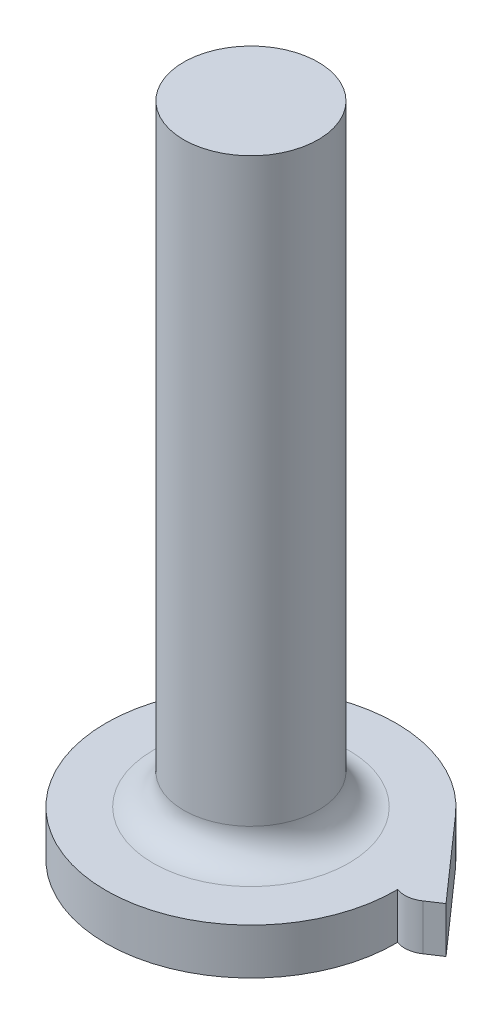
ISO-10303-21;
HEADER;
FILE_DESCRIPTION(('STEP AP214'),'2;1');
FILE_NAME('part.step','',(''),(''),'','','');
FILE_SCHEMA(('AUTOMOTIVE_DESIGN { 1 0 10303 214 1 1 1 1 }'));
ENDSEC;
DATA;
#1=APPLICATION_CONTEXT('core data for automotive mechanical design processes');
#2=APPLICATION_PROTOCOL_DEFINITION('international standard','automotive_design',2000,#1);
#3=PRODUCT_CONTEXT('',#1,'mechanical');
#4=PRODUCT('Part','Part','',(#3));
#5=PRODUCT_RELATED_PRODUCT_CATEGORY('part','',(#4));
#6=PRODUCT_DEFINITION_FORMATION('','',#4);
#7=PRODUCT_DEFINITION_CONTEXT('part definition',#1,'design');
#8=PRODUCT_DEFINITION('design','',#6,#7);
#9=PRODUCT_DEFINITION_SHAPE('','',#8);
#10=(LENGTH_UNIT() NAMED_UNIT(*) SI_UNIT(.MILLI.,.METRE.));
#11=(NAMED_UNIT(*) PLANE_ANGLE_UNIT() SI_UNIT($,.RADIAN.));
#12=(NAMED_UNIT(*) SI_UNIT($,.STERADIAN.) SOLID_ANGLE_UNIT());
#13=UNCERTAINTY_MEASURE_WITH_UNIT(LENGTH_MEASURE(1.E-05),#10,'distance_accuracy_value','');
#14=(GEOMETRIC_REPRESENTATION_CONTEXT(3) GLOBAL_UNCERTAINTY_ASSIGNED_CONTEXT((#13)) GLOBAL_UNIT_ASSIGNED_CONTEXT((#10,
#11,#12)) REPRESENTATION_CONTEXT('',''));
#15=CARTESIAN_POINT('',(0.,0.,0.));
#16=DIRECTION('',(0.,0.,1.));
#17=DIRECTION('',(1.,0.,0.));
#18=AXIS2_PLACEMENT_3D('',#15,#16,#17);
#19=CARTESIAN_POINT('',(-34.2208333619087,1.5,-108.711157920039));
#20=DIRECTION('',(0.,-1.,0.));
#21=DIRECTION('',(0.,0.,-1.));
#22=AXIS2_PLACEMENT_3D('',#19,#20,#21);
#23=CYLINDRICAL_SURFACE('',#22,4.74393717081085);
#24=CARTESIAN_POINT('',(-34.2208333619087,0.,-108.711157920039));
#25=DIRECTION('',(0.,1.,0.));
#26=DIRECTION('',(0.,0.,1.));
#27=AXIS2_PLACEMENT_3D('',#24,#25,#26);
#28=CIRCLE('',#27,4.74393717081085);
#29=CARTESIAN_POINT('',(-30.6660632601249,0.,-111.85258266115));
#30=VERTEX_POINT('',#29);
#31=CARTESIAN_POINT('',(-29.4772450581899,0.,-108.768689523733));
#32=VERTEX_POINT('',#31);
#33=EDGE_CURVE('E107',#30,#32,#28,.T.);
#34=ORIENTED_EDGE('',*,*,#33,.T.);
#35=DIRECTION('',(0.,-1.,0.));
#36=VECTOR('',#35,1.);
#37=CARTESIAN_POINT('',(-29.4772450581899,1.5,-108.768689523733));
#38=LINE('',#37,#36);
#39=CARTESIAN_POINT('',(-29.4772450581899,1.5,-108.768689523733));
#40=VERTEX_POINT('',#39);
#41=EDGE_CURVE('E98',#40,#32,#38,.T.);
#42=ORIENTED_EDGE('',*,*,#41,.F.);
#43=CARTESIAN_POINT('',(-34.2208333619087,1.5,-108.711157920039));
#44=DIRECTION('',(0.,1.,0.));
#45=DIRECTION('',(0.,0.,1.));
#46=AXIS2_PLACEMENT_3D('',#43,#44,#45);
#47=CIRCLE('',#46,4.74393717081085);
#48=CARTESIAN_POINT('',(-30.6660632601249,1.5,-111.85258266115));
#49=VERTEX_POINT('',#48);
#50=EDGE_CURVE('E92',#49,#40,#47,.T.);
#51=ORIENTED_EDGE('',*,*,#50,.F.);
#52=DIRECTION('',(0.,-1.,0.));
#53=VECTOR('',#52,1.);
#54=CARTESIAN_POINT('',(-30.6660632601249,1.5,-111.85258266115));
#55=LINE('',#54,#53);
#56=EDGE_CURVE('E103',#49,#30,#55,.T.);
#57=ORIENTED_EDGE('',*,*,#56,.T.);
#58=EDGE_LOOP('',(#34,#42,#51,#57));
#59=FACE_BOUND('',#58,.T.);
#60=ADVANCED_FACE('F39',(#59),#23,.T.);
#61=CARTESIAN_POINT('',(-29.194586089939,1.5,-109.517090424098));
#62=DIRECTION('',(0.,-1.,0.));
#63=DIRECTION('',(0.,0.,-1.));
#64=AXIS2_PLACEMENT_3D('',#61,#62,#63);
#65=CYLINDRICAL_SURFACE('',#64,0.800000000000011);
#66=CARTESIAN_POINT('',(-29.194586089939,0.,-109.517090424098));
#67=DIRECTION('',(0.,1.,0.));
#68=DIRECTION('',(0.,0.,1.));
#69=AXIS2_PLACEMENT_3D('',#66,#67,#68);
#70=CIRCLE('',#69,0.800000000000011);
#71=CARTESIAN_POINT('',(-28.7436388342605,0.,-108.85629804173));
#72=VERTEX_POINT('',#71);
#73=EDGE_CURVE('E97',#32,#72,#70,.T.);
#74=ORIENTED_EDGE('',*,*,#73,.T.);
#75=DIRECTION('',(0.,-1.,0.));
#76=VECTOR('',#75,1.);
#77=CARTESIAN_POINT('',(-28.7436388342605,1.5,-108.85629804173));
#78=LINE('',#77,#76);
#79=CARTESIAN_POINT('',(-28.7436388342605,1.5,-108.85629804173));
#80=VERTEX_POINT('',#79);
#81=EDGE_CURVE('E95',#80,#72,#78,.T.);
#82=ORIENTED_EDGE('',*,*,#81,.F.);
#83=CARTESIAN_POINT('',(-29.194586089939,1.5,-109.517090424098));
#84=DIRECTION('',(0.,1.,0.));
#85=DIRECTION('',(0.,0.,1.));
#86=AXIS2_PLACEMENT_3D('',#83,#84,#85);
#87=CIRCLE('',#86,0.800000000000011);
#88=EDGE_CURVE('E87',#40,#80,#87,.T.);
#89=ORIENTED_EDGE('',*,*,#88,.F.);
#90=ORIENTED_EDGE('',*,*,#41,.T.);
#91=EDGE_LOOP('',(#74,#82,#89,#90));
#92=FACE_BOUND('',#91,.T.);
#93=ADVANCED_FACE('F96',(#92),#65,.T.);
#94=CARTESIAN_POINT('',(-58.8281101058706,1.5,-88.9623468165901));
#95=DIRECTION('',(-0.551579760242768,0.,-0.83412215417799));
#96=DIRECTION('',(-0.83412215417799,0.,0.551579760242768));
#97=AXIS2_PLACEMENT_3D('',#94,#95,#96);
#98=PLANE('',#97);
#99=DIRECTION('',(0.83412215417799,0.,-0.551579760242768));
#100=VECTOR('',#99,1.);
#101=CARTESIAN_POINT('',(-58.8281101058706,0.,-88.9623468165901));
#102=LINE('',#101,#100);
#103=CARTESIAN_POINT('',(-28.2857588102022,0.,-109.15908025729));
#104=VERTEX_POINT('',#103);
#105=EDGE_CURVE('E73',#72,#104,#102,.T.);
#106=ORIENTED_EDGE('',*,*,#105,.T.);
#107=DIRECTION('',(0.,-1.,0.));
#108=VECTOR('',#107,1.);
#109=CARTESIAN_POINT('',(-28.2857588102022,1.5,-109.15908025729));
#110=LINE('',#109,#108);
#111=CARTESIAN_POINT('',(-28.2857588102022,1.5,-109.15908025729));
#112=VERTEX_POINT('',#111);
#113=EDGE_CURVE('E99',#112,#104,#110,.T.);
#114=ORIENTED_EDGE('',*,*,#113,.F.);
#115=DIRECTION('',(0.83412215417799,0.,-0.551579760242768));
#116=VECTOR('',#115,1.);
#117=CARTESIAN_POINT('',(-58.8281101058706,1.5,-88.9623468165901));
#118=LINE('',#117,#116);
#119=EDGE_CURVE('E90',#80,#112,#118,.T.);
#120=ORIENTED_EDGE('',*,*,#119,.F.);
#121=ORIENTED_EDGE('',*,*,#81,.T.);
#122=EDGE_LOOP('',(#106,#114,#120,#121));
#123=FACE_BOUND('',#122,.T.);
#124=ADVANCED_FACE('F101',(#123),#98,.F.);
#125=CARTESIAN_POINT('',(38.2828937444113,1.5,-33.8313944718046));
#126=DIRECTION('',(-0.749329085481153,0.,0.662197796471702));
#127=DIRECTION('',(0.662197796471702,0.,0.749329085481154));
#128=AXIS2_PLACEMENT_3D('',#125,#126,#127);
#129=PLANE('',#128);
#130=DIRECTION('',(-0.662197796471703,0.,-0.749329085481154));
#131=VECTOR('',#130,1.);
#132=CARTESIAN_POINT('',(38.2828937444113,0.,-33.8313944718046));
#133=LINE('',#132,#131);
#134=EDGE_CURVE('E79',#104,#30,#133,.T.);
#135=ORIENTED_EDGE('',*,*,#134,.T.);
#136=ORIENTED_EDGE('',*,*,#56,.F.);
#137=DIRECTION('',(-0.662197796471703,0.,-0.749329085481154));
#138=VECTOR('',#137,1.);
#139=CARTESIAN_POINT('',(38.2828937444113,1.5,-33.8313944718046));
#140=LINE('',#139,#138);
#141=EDGE_CURVE('E56',#112,#49,#140,.T.);
#142=ORIENTED_EDGE('',*,*,#141,.F.);
#143=ORIENTED_EDGE('',*,*,#113,.T.);
#144=EDGE_LOOP('',(#135,#136,#142,#143));
#145=FACE_BOUND('',#144,.T.);
#146=ADVANCED_FACE('F145',(#145),#129,.F.);
#147=CARTESIAN_POINT('',(0.,1.5,0.));
#148=DIRECTION('',(0.,1.,0.));
#149=DIRECTION('',(0.,0.,1.));
#150=AXIS2_PLACEMENT_3D('',#147,#148,#149);
#151=PLANE('',#150);
#152=CARTESIAN_POINT('',(-34.2208333619087,1.5,-108.711157920039));
#153=DIRECTION('',(0.,1.,0.));
#154=DIRECTION('',(0.,0.,1.));
#155=AXIS2_PLACEMENT_3D('',#152,#153,#154);
#156=CIRCLE('',#155,3.2);
#157=CARTESIAN_POINT('',(-34.2208333619087,1.5,-105.511157920039));
#158=VERTEX_POINT('',#157);
#159=EDGE_CURVE('E11',#158,#158,#156,.F.);
#160=ORIENTED_EDGE('',*,*,#159,.T.);
#161=EDGE_LOOP('',(#160));
#162=FACE_BOUND('',#161,.T.);
#163=ORIENTED_EDGE('',*,*,#50,.T.);
#164=ORIENTED_EDGE('',*,*,#88,.T.);
#165=ORIENTED_EDGE('',*,*,#119,.T.);
#166=ORIENTED_EDGE('',*,*,#141,.T.);
#167=EDGE_LOOP('',(#163,#164,#165,#166));
#168=FACE_BOUND('',#167,.T.);
#169=ADVANCED_FACE('F88',(#162,#168),#151,.T.);
#170=CARTESIAN_POINT('',(0.,0.,0.));
#171=DIRECTION('',(0.,1.,0.));
#172=DIRECTION('',(0.,0.,1.));
#173=AXIS2_PLACEMENT_3D('',#170,#171,#172);
#174=PLANE('',#173);
#175=CARTESIAN_POINT('',(-34.2208333619087,0.,-108.711157920039));
#176=DIRECTION('',(0.,-1.,0.));
#177=DIRECTION('',(0.,0.,-1.));
#178=AXIS2_PLACEMENT_3D('',#175,#176,#177);
#179=CIRCLE('',#178,2.5);
#180=CARTESIAN_POINT('',(-34.2208333619087,0.,-111.211157920039));
#181=VERTEX_POINT('',#180);
#182=EDGE_CURVE('E164',#181,#181,#179,.T.);
#183=ORIENTED_EDGE('',*,*,#182,.F.);
#184=EDGE_LOOP('',(#183));
#185=FACE_BOUND('',#184,.T.);
#186=ORIENTED_EDGE('',*,*,#33,.F.);
#187=ORIENTED_EDGE('',*,*,#134,.F.);
#188=ORIENTED_EDGE('',*,*,#105,.F.);
#189=ORIENTED_EDGE('',*,*,#73,.F.);
#190=EDGE_LOOP('',(#186,#187,#188,#189));
#191=FACE_BOUND('',#190,.T.);
#192=ADVANCED_FACE('F148',(#185,#191),#174,.F.);
#193=CARTESIAN_POINT('',(-34.2208333619087,21.5,-108.711157920039));
#194=DIRECTION('',(0.,-1.,0.));
#195=DIRECTION('',(0.,0.,-1.));
#196=AXIS2_PLACEMENT_3D('',#193,#194,#195);
#197=CYLINDRICAL_SURFACE('',#196,2.2);
#198=CARTESIAN_POINT('',(-34.2208333619087,2.5,-108.711157920039));
#199=DIRECTION('',(0.,1.,0.));
#200=DIRECTION('',(0.,0.,1.));
#201=AXIS2_PLACEMENT_3D('',#198,#199,#200);
#202=CIRCLE('',#201,2.2);
#203=CARTESIAN_POINT('',(-34.2208333619087,2.5,-106.511157920039));
#204=VERTEX_POINT('',#203);
#205=EDGE_CURVE('E48',#204,#204,#202,.T.);
#206=ORIENTED_EDGE('',*,*,#205,.T.);
#207=EDGE_LOOP('',(#206));
#208=FACE_BOUND('',#207,.T.);
#209=CARTESIAN_POINT('',(-34.2208333619087,21.5,-108.711157920039));
#210=DIRECTION('',(0.,1.,0.));
#211=DIRECTION('',(0.,0.,1.));
#212=AXIS2_PLACEMENT_3D('',#209,#210,#211);
#213=CIRCLE('',#212,2.2);
#214=CARTESIAN_POINT('',(-34.2208333619087,21.5,-106.511157920039));
#215=VERTEX_POINT('',#214);
#216=EDGE_CURVE('E110',#215,#215,#213,.T.);
#217=ORIENTED_EDGE('',*,*,#216,.F.);
#218=EDGE_LOOP('',(#217));
#219=FACE_BOUND('',#218,.T.);
#220=ADVANCED_FACE('F119',(#208,#219),#197,.T.);
#221=CARTESIAN_POINT('',(-34.2208333619087,21.5,-108.711157920039));
#222=DIRECTION('',(0.,1.,0.));
#223=DIRECTION('',(0.,0.,1.));
#224=AXIS2_PLACEMENT_3D('',#221,#222,#223);
#225=PLANE('',#224);
#226=ORIENTED_EDGE('',*,*,#216,.T.);
#227=EDGE_LOOP('',(#226));
#228=FACE_BOUND('',#227,.T.);
#229=ADVANCED_FACE('F124',(#228),#225,.T.);
#230=CARTESIAN_POINT('',(-34.2208333619087,2.5,-108.711157920039));
#231=DIRECTION('',(0.,1.,0.));
#232=DIRECTION('',(0.,0.,1.));
#233=AXIS2_PLACEMENT_3D('',#230,#231,#232);
#234=TOROIDAL_SURFACE('',#233,3.2,1.);
#235=ORIENTED_EDGE('',*,*,#159,.F.);
#236=EDGE_LOOP('',(#235));
#237=FACE_BOUND('',#236,.T.);
#238=ORIENTED_EDGE('',*,*,#205,.F.);
#239=EDGE_LOOP('',(#238));
#240=FACE_BOUND('',#239,.T.);
#241=ADVANCED_FACE('F41',(#237,#240),#234,.F.);
#242=CARTESIAN_POINT('',(-34.2208333619087,0.5,-108.711157920039));
#243=DIRECTION('',(0.,-1.,0.));
#244=DIRECTION('',(0.,0.,-1.));
#245=AXIS2_PLACEMENT_3D('',#242,#243,#244);
#246=CYLINDRICAL_SURFACE('',#245,2.5);
#247=CARTESIAN_POINT('',(-34.2208333619087,0.5,-108.711157920039));
#248=DIRECTION('',(0.,-1.,0.));
#249=DIRECTION('',(0.,0.,-1.));
#250=AXIS2_PLACEMENT_3D('',#247,#248,#249);
#251=CIRCLE('',#250,2.5);
#252=CARTESIAN_POINT('',(-34.2208333619087,0.5,-111.211157920039));
#253=VERTEX_POINT('',#252);
#254=EDGE_CURVE('E163',#253,#253,#251,.T.);
#255=ORIENTED_EDGE('',*,*,#254,.F.);
#256=EDGE_LOOP('',(#255));
#257=FACE_BOUND('',#256,.T.);
#258=ORIENTED_EDGE('',*,*,#182,.T.);
#259=EDGE_LOOP('',(#258));
#260=FACE_BOUND('',#259,.T.);
#261=ADVANCED_FACE('F123',(#257,#260),#246,.F.);
#262=CARTESIAN_POINT('',(-34.2208333619087,0.5,-108.711157920039));
#263=DIRECTION('',(0.,-1.,0.));
#264=DIRECTION('',(0.,0.,-1.));
#265=AXIS2_PLACEMENT_3D('',#262,#263,#264);
#266=PLANE('',#265);
#267=ORIENTED_EDGE('',*,*,#254,.T.);
#268=EDGE_LOOP('',(#267));
#269=FACE_BOUND('',#268,.T.);
#270=ADVANCED_FACE('F130',(#269),#266,.T.);
#271=CLOSED_SHELL('',(#60,#93,#124,#146,#169,#192,#220,#229,#241,#261,#270));
#272=MANIFOLD_SOLID_BREP('B2',#271);
#273=ADVANCED_BREP_SHAPE_REPRESENTATION('',(#18,#272),#14);
#274=SHAPE_DEFINITION_REPRESENTATION(#9,#273);
ENDSEC;
END-ISO-10303-21;
